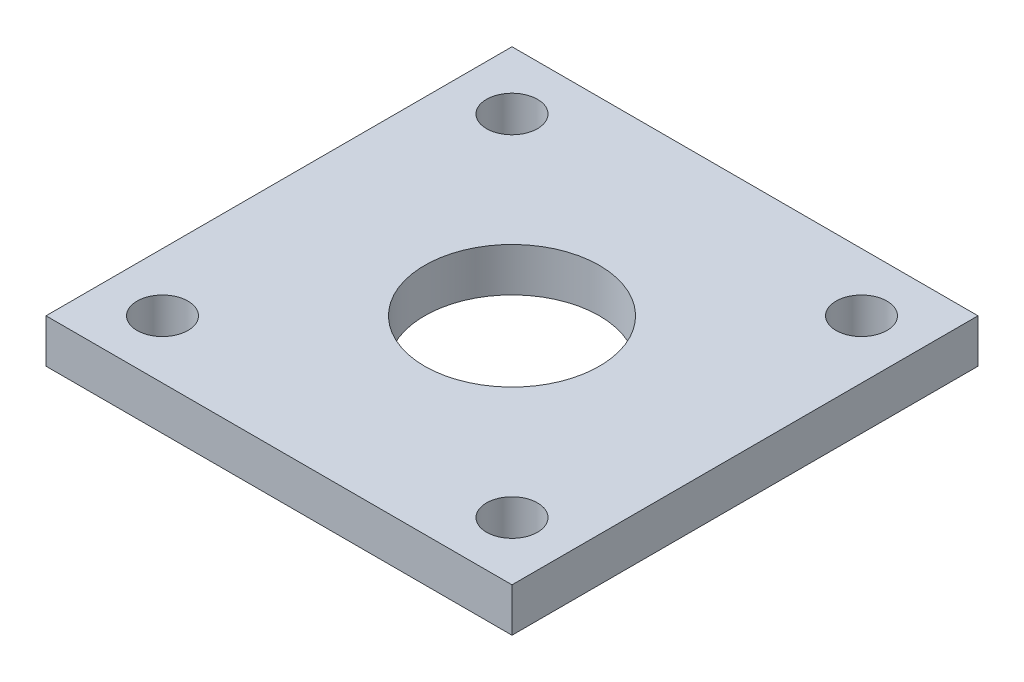
ISO-10303-21;
HEADER;
FILE_DESCRIPTION(('STEP AP214'),'2;1');
FILE_NAME('part.step','',(''),(''),'','','');
FILE_SCHEMA(('AUTOMOTIVE_DESIGN { 1 0 10303 214 1 1 1 1 }'));
ENDSEC;
DATA;
#1=APPLICATION_CONTEXT('core data for automotive mechanical design processes');
#2=APPLICATION_PROTOCOL_DEFINITION('international standard','automotive_design',2000,#1);
#3=PRODUCT_CONTEXT('',#1,'mechanical');
#4=PRODUCT('Part','Part','',(#3));
#5=PRODUCT_RELATED_PRODUCT_CATEGORY('part','',(#4));
#6=PRODUCT_DEFINITION_FORMATION('','',#4);
#7=PRODUCT_DEFINITION_CONTEXT('part definition',#1,'design');
#8=PRODUCT_DEFINITION('design','',#6,#7);
#9=PRODUCT_DEFINITION_SHAPE('','',#8);
#10=(LENGTH_UNIT() NAMED_UNIT(*) SI_UNIT(.MILLI.,.METRE.));
#11=(NAMED_UNIT(*) PLANE_ANGLE_UNIT() SI_UNIT($,.RADIAN.));
#12=(NAMED_UNIT(*) SI_UNIT($,.STERADIAN.) SOLID_ANGLE_UNIT());
#13=UNCERTAINTY_MEASURE_WITH_UNIT(LENGTH_MEASURE(1.E-05),#10,'distance_accuracy_value','');
#14=(GEOMETRIC_REPRESENTATION_CONTEXT(3) GLOBAL_UNCERTAINTY_ASSIGNED_CONTEXT((#13)) GLOBAL_UNIT_ASSIGNED_CONTEXT((#10,
#11,#12)) REPRESENTATION_CONTEXT('',''));
#15=CARTESIAN_POINT('',(0.,0.,0.));
#16=DIRECTION('',(0.,0.,1.));
#17=DIRECTION('',(1.,0.,0.));
#18=AXIS2_PLACEMENT_3D('',#15,#16,#17);
#19=CARTESIAN_POINT('',(0.,3.0042,0.));
#20=DIRECTION('',(0.,1.,0.));
#21=DIRECTION('',(0.,0.,1.));
#22=AXIS2_PLACEMENT_3D('',#19,#20,#21);
#23=PLANE('',#22);
#24=CARTESIAN_POINT('',(28.,3.0042,28.));
#25=DIRECTION('',(0.,1.,0.));
#26=DIRECTION('',(0.,0.,1.));
#27=AXIS2_PLACEMENT_3D('',#24,#25,#26);
#28=CIRCLE('',#27,1.75);
#29=CARTESIAN_POINT('',(28.,3.0042,29.75));
#30=VERTEX_POINT('',#29);
#31=EDGE_CURVE('E90',#30,#30,#28,.F.);
#32=ORIENTED_EDGE('',*,*,#31,.T.);
#33=EDGE_LOOP('',(#32));
#34=FACE_BOUND('',#33,.T.);
#35=CARTESIAN_POINT('',(16.,3.0042,16.));
#36=DIRECTION('',(0.,1.,0.));
#37=DIRECTION('',(0.,0.,1.));
#38=AXIS2_PLACEMENT_3D('',#35,#36,#37);
#39=CIRCLE('',#38,6.);
#40=CARTESIAN_POINT('',(16.,3.0042,22.));
#41=VERTEX_POINT('',#40);
#42=EDGE_CURVE('E93',#41,#41,#39,.F.);
#43=ORIENTED_EDGE('',*,*,#42,.T.);
#44=EDGE_LOOP('',(#43));
#45=FACE_BOUND('',#44,.T.);
#46=CARTESIAN_POINT('',(28.,3.0042,4.));
#47=DIRECTION('',(0.,1.,0.));
#48=DIRECTION('',(0.,0.,1.));
#49=AXIS2_PLACEMENT_3D('',#46,#47,#48);
#50=CIRCLE('',#49,1.75);
#51=CARTESIAN_POINT('',(28.,3.0042,5.75));
#52=VERTEX_POINT('',#51);
#53=EDGE_CURVE('E96',#52,#52,#50,.F.);
#54=ORIENTED_EDGE('',*,*,#53,.T.);
#55=EDGE_LOOP('',(#54));
#56=FACE_BOUND('',#55,.T.);
#57=CARTESIAN_POINT('',(4.,3.0042,28.));
#58=DIRECTION('',(0.,1.,0.));
#59=DIRECTION('',(0.,0.,1.));
#60=AXIS2_PLACEMENT_3D('',#57,#58,#59);
#61=CIRCLE('',#60,1.75);
#62=CARTESIAN_POINT('',(4.,3.0042,29.75));
#63=VERTEX_POINT('',#62);
#64=EDGE_CURVE('E98',#63,#63,#61,.F.);
#65=ORIENTED_EDGE('',*,*,#64,.T.);
#66=EDGE_LOOP('',(#65));
#67=FACE_BOUND('',#66,.T.);
#68=CARTESIAN_POINT('',(4.,3.0042,4.));
#69=DIRECTION('',(0.,1.,0.));
#70=DIRECTION('',(0.,0.,1.));
#71=AXIS2_PLACEMENT_3D('',#68,#69,#70);
#72=CIRCLE('',#71,1.75);
#73=CARTESIAN_POINT('',(4.,3.0042,5.75));
#74=VERTEX_POINT('',#73);
#75=EDGE_CURVE('E18',#74,#74,#72,.F.);
#76=ORIENTED_EDGE('',*,*,#75,.T.);
#77=EDGE_LOOP('',(#76));
#78=FACE_BOUND('',#77,.T.);
#79=DIRECTION('',(1.,0.,0.));
#80=VECTOR('',#79,1.);
#81=CARTESIAN_POINT('',(0.,3.0042,32.));
#82=LINE('',#81,#80);
#83=CARTESIAN_POINT('',(32.,3.0042,32.));
#84=VERTEX_POINT('',#83);
#85=CARTESIAN_POINT('',(0.,3.0042,32.));
#86=VERTEX_POINT('',#85);
#87=EDGE_CURVE('E112',#84,#86,#82,.F.);
#88=ORIENTED_EDGE('',*,*,#87,.F.);
#89=DIRECTION('',(0.,0.,-1.));
#90=VECTOR('',#89,1.);
#91=CARTESIAN_POINT('',(32.,3.0042,0.));
#92=LINE('',#91,#90);
#93=CARTESIAN_POINT('',(32.,3.0042,0.));
#94=VERTEX_POINT('',#93);
#95=EDGE_CURVE('E58',#94,#84,#92,.F.);
#96=ORIENTED_EDGE('',*,*,#95,.F.);
#97=DIRECTION('',(1.,0.,0.));
#98=VECTOR('',#97,1.);
#99=CARTESIAN_POINT('',(0.,3.0042,0.));
#100=LINE('',#99,#98);
#101=CARTESIAN_POINT('',(0.,3.0042,0.));
#102=VERTEX_POINT('',#101);
#103=EDGE_CURVE('E57',#94,#102,#100,.F.);
#104=ORIENTED_EDGE('',*,*,#103,.T.);
#105=DIRECTION('',(0.,0.,-1.));
#106=VECTOR('',#105,1.);
#107=CARTESIAN_POINT('',(0.,3.0042,0.));
#108=LINE('',#107,#106);
#109=EDGE_CURVE('E54',#102,#86,#108,.F.);
#110=ORIENTED_EDGE('',*,*,#109,.T.);
#111=EDGE_LOOP('',(#88,#96,#104,#110));
#112=FACE_BOUND('',#111,.T.);
#113=ADVANCED_FACE('F15',(#34,#45,#56,#67,#78,#112),#23,.T.);
#114=CARTESIAN_POINT('',(0.,0.004199999999969,0.));
#115=DIRECTION('',(0.,0.,1.));
#116=DIRECTION('',(1.,0.,0.));
#117=AXIS2_PLACEMENT_3D('',#114,#115,#116);
#118=PLANE('',#117);
#119=DIRECTION('',(0.,1.,0.));
#120=VECTOR('',#119,1.);
#121=CARTESIAN_POINT('',(32.,0.004199999999969,0.));
#122=LINE('',#121,#120);
#123=CARTESIAN_POINT('',(32.,0.004199999999969,0.));
#124=VERTEX_POINT('',#123);
#125=EDGE_CURVE('E106',#124,#94,#122,.T.);
#126=ORIENTED_EDGE('',*,*,#125,.F.);
#127=DIRECTION('',(1.,0.,0.));
#128=VECTOR('',#127,1.);
#129=CARTESIAN_POINT('',(0.,0.004199999999969,0.));
#130=LINE('',#129,#128);
#131=CARTESIAN_POINT('',(0.,0.004199999999969,0.));
#132=VERTEX_POINT('',#131);
#133=EDGE_CURVE('E74',#124,#132,#130,.F.);
#134=ORIENTED_EDGE('',*,*,#133,.T.);
#135=DIRECTION('',(0.,1.,0.));
#136=VECTOR('',#135,1.);
#137=CARTESIAN_POINT('',(0.,0.004199999999969,0.));
#138=LINE('',#137,#136);
#139=EDGE_CURVE('E63',#132,#102,#138,.T.);
#140=ORIENTED_EDGE('',*,*,#139,.T.);
#141=ORIENTED_EDGE('',*,*,#103,.F.);
#142=EDGE_LOOP('',(#126,#134,#140,#141));
#143=FACE_BOUND('',#142,.T.);
#144=ADVANCED_FACE('F73',(#143),#118,.F.);
#145=CARTESIAN_POINT('',(0.,0.004199999999969,0.));
#146=DIRECTION('',(1.,0.,0.));
#147=DIRECTION('',(0.,0.,-1.));
#148=AXIS2_PLACEMENT_3D('',#145,#146,#147);
#149=PLANE('',#148);
#150=ORIENTED_EDGE('',*,*,#109,.F.);
#151=ORIENTED_EDGE('',*,*,#139,.F.);
#152=DIRECTION('',(0.,0.,1.));
#153=VECTOR('',#152,1.);
#154=CARTESIAN_POINT('',(0.,0.004199999999969,0.));
#155=LINE('',#154,#153);
#156=CARTESIAN_POINT('',(0.,0.004199999999969,32.));
#157=VERTEX_POINT('',#156);
#158=EDGE_CURVE('E120',#132,#157,#155,.T.);
#159=ORIENTED_EDGE('',*,*,#158,.T.);
#160=DIRECTION('',(0.,1.,0.));
#161=VECTOR('',#160,1.);
#162=CARTESIAN_POINT('',(0.,0.004199999999969,32.));
#163=LINE('',#162,#161);
#164=EDGE_CURVE('E70',#86,#157,#163,.F.);
#165=ORIENTED_EDGE('',*,*,#164,.F.);
#166=EDGE_LOOP('',(#150,#151,#159,#165));
#167=FACE_BOUND('',#166,.T.);
#168=ADVANCED_FACE('F67',(#167),#149,.F.);
#169=CARTESIAN_POINT('',(0.,0.004199999999969,32.));
#170=DIRECTION('',(0.,0.,1.));
#171=DIRECTION('',(1.,0.,0.));
#172=AXIS2_PLACEMENT_3D('',#169,#170,#171);
#173=PLANE('',#172);
#174=DIRECTION('',(0.,1.,0.));
#175=VECTOR('',#174,1.);
#176=CARTESIAN_POINT('',(32.,0.004199999999969,32.));
#177=LINE('',#176,#175);
#178=CARTESIAN_POINT('',(32.,0.004199999999969,32.));
#179=VERTEX_POINT('',#178);
#180=EDGE_CURVE('E33',#84,#179,#177,.F.);
#181=ORIENTED_EDGE('',*,*,#180,.F.);
#182=ORIENTED_EDGE('',*,*,#87,.T.);
#183=ORIENTED_EDGE('',*,*,#164,.T.);
#184=DIRECTION('',(1.,0.,0.));
#185=VECTOR('',#184,1.);
#186=CARTESIAN_POINT('',(0.,0.004199999999969,32.));
#187=LINE('',#186,#185);
#188=EDGE_CURVE('E117',#157,#179,#187,.T.);
#189=ORIENTED_EDGE('',*,*,#188,.T.);
#190=EDGE_LOOP('',(#181,#182,#183,#189));
#191=FACE_BOUND('',#190,.T.);
#192=ADVANCED_FACE('F116',(#191),#173,.T.);
#193=CARTESIAN_POINT('',(32.,0.004199999999969,0.));
#194=DIRECTION('',(1.,0.,0.));
#195=DIRECTION('',(0.,0.,-1.));
#196=AXIS2_PLACEMENT_3D('',#193,#194,#195);
#197=PLANE('',#196);
#198=ORIENTED_EDGE('',*,*,#95,.T.);
#199=ORIENTED_EDGE('',*,*,#180,.T.);
#200=DIRECTION('',(0.,0.,1.));
#201=VECTOR('',#200,1.);
#202=CARTESIAN_POINT('',(32.,0.004199999999969,0.));
#203=LINE('',#202,#201);
#204=EDGE_CURVE('E89',#179,#124,#203,.F.);
#205=ORIENTED_EDGE('',*,*,#204,.T.);
#206=ORIENTED_EDGE('',*,*,#125,.T.);
#207=EDGE_LOOP('',(#198,#199,#205,#206));
#208=FACE_BOUND('',#207,.T.);
#209=ADVANCED_FACE('F123',(#208),#197,.T.);
#210=CARTESIAN_POINT('',(4.,0.004199999999969,4.));
#211=DIRECTION('',(0.,1.,0.));
#212=DIRECTION('',(0.,0.,1.));
#213=AXIS2_PLACEMENT_3D('',#210,#211,#212);
#214=CYLINDRICAL_SURFACE('',#213,1.75);
#215=CARTESIAN_POINT('',(4.,0.004199999999969,4.));
#216=DIRECTION('',(0.,1.,0.));
#217=DIRECTION('',(0.,0.,1.));
#218=AXIS2_PLACEMENT_3D('',#215,#216,#217);
#219=CIRCLE('',#218,1.75);
#220=CARTESIAN_POINT('',(4.,0.004199999999969,5.75));
#221=VERTEX_POINT('',#220);
#222=EDGE_CURVE('E86',#221,#221,#219,.F.);
#223=ORIENTED_EDGE('',*,*,#222,.T.);
#224=EDGE_LOOP('',(#223));
#225=FACE_BOUND('',#224,.T.);
#226=ORIENTED_EDGE('',*,*,#75,.F.);
#227=EDGE_LOOP('',(#226));
#228=FACE_BOUND('',#227,.T.);
#229=ADVANCED_FACE('F125',(#225,#228),#214,.F.);
#230=CARTESIAN_POINT('',(4.,0.004199999999969,28.));
#231=DIRECTION('',(0.,1.,0.));
#232=DIRECTION('',(0.,0.,1.));
#233=AXIS2_PLACEMENT_3D('',#230,#231,#232);
#234=CYLINDRICAL_SURFACE('',#233,1.75);
#235=CARTESIAN_POINT('',(4.,0.004199999999969,28.));
#236=DIRECTION('',(0.,1.,0.));
#237=DIRECTION('',(0.,0.,1.));
#238=AXIS2_PLACEMENT_3D('',#235,#236,#237);
#239=CIRCLE('',#238,1.75);
#240=CARTESIAN_POINT('',(4.,0.004199999999969,29.75));
#241=VERTEX_POINT('',#240);
#242=EDGE_CURVE('E83',#241,#241,#239,.F.);
#243=ORIENTED_EDGE('',*,*,#242,.T.);
#244=EDGE_LOOP('',(#243));
#245=FACE_BOUND('',#244,.T.);
#246=ORIENTED_EDGE('',*,*,#64,.F.);
#247=EDGE_LOOP('',(#246));
#248=FACE_BOUND('',#247,.T.);
#249=ADVANCED_FACE('F132',(#245,#248),#234,.F.);
#250=CARTESIAN_POINT('',(28.,0.004199999999969,4.));
#251=DIRECTION('',(0.,1.,0.));
#252=DIRECTION('',(0.,0.,1.));
#253=AXIS2_PLACEMENT_3D('',#250,#251,#252);
#254=CYLINDRICAL_SURFACE('',#253,1.75);
#255=CARTESIAN_POINT('',(28.,0.004199999999969,4.));
#256=DIRECTION('',(0.,1.,0.));
#257=DIRECTION('',(0.,0.,1.));
#258=AXIS2_PLACEMENT_3D('',#255,#256,#257);
#259=CIRCLE('',#258,1.75);
#260=CARTESIAN_POINT('',(28.,0.004199999999969,5.75));
#261=VERTEX_POINT('',#260);
#262=EDGE_CURVE('E80',#261,#261,#259,.F.);
#263=ORIENTED_EDGE('',*,*,#262,.T.);
#264=EDGE_LOOP('',(#263));
#265=FACE_BOUND('',#264,.T.);
#266=ORIENTED_EDGE('',*,*,#53,.F.);
#267=EDGE_LOOP('',(#266));
#268=FACE_BOUND('',#267,.T.);
#269=ADVANCED_FACE('F151',(#265,#268),#254,.F.);
#270=CARTESIAN_POINT('',(16.,0.004199999999969,16.));
#271=DIRECTION('',(0.,1.,0.));
#272=DIRECTION('',(0.,0.,1.));
#273=AXIS2_PLACEMENT_3D('',#270,#271,#272);
#274=CYLINDRICAL_SURFACE('',#273,6.);
#275=CARTESIAN_POINT('',(16.,0.004199999999969,16.));
#276=DIRECTION('',(0.,1.,0.));
#277=DIRECTION('',(0.,0.,1.));
#278=AXIS2_PLACEMENT_3D('',#275,#276,#277);
#279=CIRCLE('',#278,6.);
#280=CARTESIAN_POINT('',(16.,0.004199999999969,22.));
#281=VERTEX_POINT('',#280);
#282=EDGE_CURVE('E24',#281,#281,#279,.F.);
#283=ORIENTED_EDGE('',*,*,#282,.T.);
#284=EDGE_LOOP('',(#283));
#285=FACE_BOUND('',#284,.T.);
#286=ORIENTED_EDGE('',*,*,#42,.F.);
#287=EDGE_LOOP('',(#286));
#288=FACE_BOUND('',#287,.T.);
#289=ADVANCED_FACE('F143',(#285,#288),#274,.F.);
#290=CARTESIAN_POINT('',(28.,0.004199999999969,28.));
#291=DIRECTION('',(0.,1.,0.));
#292=DIRECTION('',(0.,0.,1.));
#293=AXIS2_PLACEMENT_3D('',#290,#291,#292);
#294=CYLINDRICAL_SURFACE('',#293,1.75);
#295=CARTESIAN_POINT('',(28.,0.004199999999969,28.));
#296=DIRECTION('',(0.,1.,0.));
#297=DIRECTION('',(0.,0.,1.));
#298=AXIS2_PLACEMENT_3D('',#295,#296,#297);
#299=CIRCLE('',#298,1.75);
#300=CARTESIAN_POINT('',(28.,0.004199999999969,29.75));
#301=VERTEX_POINT('',#300);
#302=EDGE_CURVE('E9',#301,#301,#299,.F.);
#303=ORIENTED_EDGE('',*,*,#302,.T.);
#304=EDGE_LOOP('',(#303));
#305=FACE_BOUND('',#304,.T.);
#306=ORIENTED_EDGE('',*,*,#31,.F.);
#307=EDGE_LOOP('',(#306));
#308=FACE_BOUND('',#307,.T.);
#309=ADVANCED_FACE('F137',(#305,#308),#294,.F.);
#310=CARTESIAN_POINT('',(0.,0.004199999999969,0.));
#311=DIRECTION('',(0.,1.,0.));
#312=DIRECTION('',(0.,0.,1.));
#313=AXIS2_PLACEMENT_3D('',#310,#311,#312);
#314=PLANE('',#313);
#315=ORIENTED_EDGE('',*,*,#302,.F.);
#316=EDGE_LOOP('',(#315));
#317=FACE_BOUND('',#316,.T.);
#318=ORIENTED_EDGE('',*,*,#282,.F.);
#319=EDGE_LOOP('',(#318));
#320=FACE_BOUND('',#319,.T.);
#321=ORIENTED_EDGE('',*,*,#262,.F.);
#322=EDGE_LOOP('',(#321));
#323=FACE_BOUND('',#322,.T.);
#324=ORIENTED_EDGE('',*,*,#242,.F.);
#325=EDGE_LOOP('',(#324));
#326=FACE_BOUND('',#325,.T.);
#327=ORIENTED_EDGE('',*,*,#222,.F.);
#328=EDGE_LOOP('',(#327));
#329=FACE_BOUND('',#328,.T.);
#330=ORIENTED_EDGE('',*,*,#188,.F.);
#331=ORIENTED_EDGE('',*,*,#158,.F.);
#332=ORIENTED_EDGE('',*,*,#133,.F.);
#333=ORIENTED_EDGE('',*,*,#204,.F.);
#334=EDGE_LOOP('',(#330,#331,#332,#333));
#335=FACE_BOUND('',#334,.T.);
#336=ADVANCED_FACE('F119',(#317,#320,#323,#326,#329,#335),#314,.F.);
#337=CLOSED_SHELL('',(#113,#144,#168,#192,#209,#229,#249,#269,#289,#309,#336));
#338=MANIFOLD_SOLID_BREP('B1',#337);
#339=ADVANCED_BREP_SHAPE_REPRESENTATION('',(#18,#338),#14);
#340=SHAPE_DEFINITION_REPRESENTATION(#9,#339);
ENDSEC;
END-ISO-10303-21;
